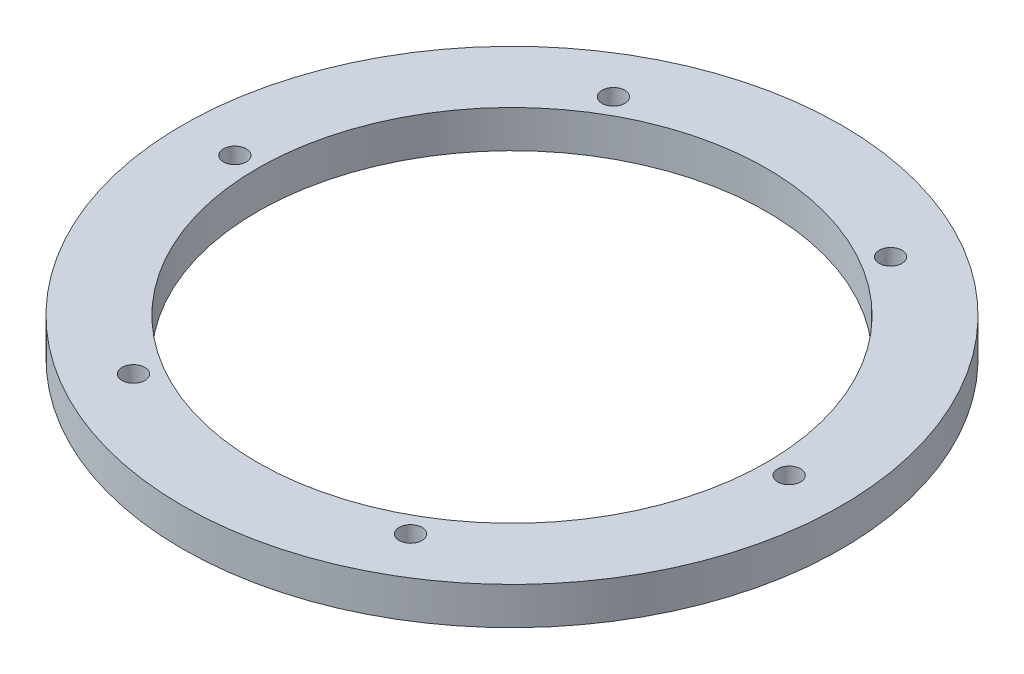
ISO-10303-21;
HEADER;
FILE_DESCRIPTION(('STEP AP214'),'2;1');
FILE_NAME('part.step','',(''),(''),'','','');
FILE_SCHEMA(('AUTOMOTIVE_DESIGN { 1 0 10303 214 1 1 1 1 }'));
ENDSEC;
DATA;
#1=APPLICATION_CONTEXT('core data for automotive mechanical design processes');
#2=APPLICATION_PROTOCOL_DEFINITION('international standard','automotive_design',2000,#1);
#3=PRODUCT_CONTEXT('',#1,'mechanical');
#4=PRODUCT('Part','Part','',(#3));
#5=PRODUCT_RELATED_PRODUCT_CATEGORY('part','',(#4));
#6=PRODUCT_DEFINITION_FORMATION('','',#4);
#7=PRODUCT_DEFINITION_CONTEXT('part definition',#1,'design');
#8=PRODUCT_DEFINITION('design','',#6,#7);
#9=PRODUCT_DEFINITION_SHAPE('','',#8);
#10=(LENGTH_UNIT() NAMED_UNIT(*) SI_UNIT(.MILLI.,.METRE.));
#11=(NAMED_UNIT(*) PLANE_ANGLE_UNIT() SI_UNIT($,.RADIAN.));
#12=(NAMED_UNIT(*) SI_UNIT($,.STERADIAN.) SOLID_ANGLE_UNIT());
#13=UNCERTAINTY_MEASURE_WITH_UNIT(LENGTH_MEASURE(1.E-05),#10,'distance_accuracy_value','');
#14=(GEOMETRIC_REPRESENTATION_CONTEXT(3) GLOBAL_UNCERTAINTY_ASSIGNED_CONTEXT((#13)) GLOBAL_UNIT_ASSIGNED_CONTEXT((#10,
#11,#12)) REPRESENTATION_CONTEXT('',''));
#15=CARTESIAN_POINT('',(0.,0.,0.));
#16=DIRECTION('',(0.,0.,1.));
#17=DIRECTION('',(1.,0.,0.));
#18=AXIS2_PLACEMENT_3D('',#15,#16,#17);
#19=CARTESIAN_POINT('',(0.,5.,0.));
#20=DIRECTION('',(0.,1.,0.));
#21=DIRECTION('',(0.,0.,1.));
#22=AXIS2_PLACEMENT_3D('',#19,#20,#21);
#23=PLANE('',#22);
#24=CARTESIAN_POINT('',(-18.5,5.,-32.0429399400242));
#25=DIRECTION('',(0.,1.,0.));
#26=DIRECTION('',(0.,0.,1.));
#27=AXIS2_PLACEMENT_3D('',#24,#25,#26);
#28=CIRCLE('',#27,1.525);
#29=CARTESIAN_POINT('',(-18.5,5.,-30.5179399400242));
#30=VERTEX_POINT('',#29);
#31=EDGE_CURVE('E78',#30,#30,#28,.T.);
#32=ORIENTED_EDGE('',*,*,#31,.F.);
#33=EDGE_LOOP('',(#32));
#34=FACE_BOUND('',#33,.T.);
#35=CARTESIAN_POINT('',(-18.5,5.,32.0429399400242));
#36=DIRECTION('',(0.,1.,0.));
#37=DIRECTION('',(0.,0.,1.));
#38=AXIS2_PLACEMENT_3D('',#35,#36,#37);
#39=CIRCLE('',#38,1.52499999999999);
#40=CARTESIAN_POINT('',(-18.5,5.,33.5679399400242));
#41=VERTEX_POINT('',#40);
#42=EDGE_CURVE('E70',#41,#41,#39,.T.);
#43=ORIENTED_EDGE('',*,*,#42,.F.);
#44=EDGE_LOOP('',(#43));
#45=FACE_BOUND('',#44,.T.);
#46=CARTESIAN_POINT('',(37.,5.,0.));
#47=DIRECTION('',(0.,1.,0.));
#48=DIRECTION('',(0.,0.,1.));
#49=AXIS2_PLACEMENT_3D('',#46,#47,#48);
#50=CIRCLE('',#49,1.525);
#51=CARTESIAN_POINT('',(37.,5.,1.525));
#52=VERTEX_POINT('',#51);
#53=EDGE_CURVE('E54',#52,#52,#50,.T.);
#54=ORIENTED_EDGE('',*,*,#53,.F.);
#55=EDGE_LOOP('',(#54));
#56=FACE_BOUND('',#55,.T.);
#57=CARTESIAN_POINT('',(0.,5.,0.));
#58=DIRECTION('',(0.,1.,0.));
#59=DIRECTION('',(0.,0.,1.));
#60=AXIS2_PLACEMENT_3D('',#57,#58,#59);
#61=CIRCLE('',#60,44.);
#62=CARTESIAN_POINT('',(0.,5.,44.));
#63=VERTEX_POINT('',#62);
#64=EDGE_CURVE('E10',#63,#63,#61,.T.);
#65=ORIENTED_EDGE('',*,*,#64,.T.);
#66=EDGE_LOOP('',(#65));
#67=FACE_BOUND('',#66,.T.);
#68=CARTESIAN_POINT('',(0.,5.,0.));
#69=DIRECTION('',(0.,1.,0.));
#70=DIRECTION('',(0.,0.,1.));
#71=AXIS2_PLACEMENT_3D('',#68,#69,#70);
#72=CIRCLE('',#71,34.);
#73=CARTESIAN_POINT('',(0.,5.,34.));
#74=VERTEX_POINT('',#73);
#75=EDGE_CURVE('E49',#74,#74,#72,.T.);
#76=ORIENTED_EDGE('',*,*,#75,.F.);
#77=EDGE_LOOP('',(#76));
#78=FACE_BOUND('',#77,.T.);
#79=CARTESIAN_POINT('',(18.5,5.,32.0429399400242));
#80=DIRECTION('',(0.,1.,0.));
#81=DIRECTION('',(0.,0.,1.));
#82=AXIS2_PLACEMENT_3D('',#79,#80,#81);
#83=CIRCLE('',#82,1.525);
#84=CARTESIAN_POINT('',(18.5,5.,33.5679399400242));
#85=VERTEX_POINT('',#84);
#86=EDGE_CURVE('E61',#85,#85,#83,.T.);
#87=ORIENTED_EDGE('',*,*,#86,.F.);
#88=EDGE_LOOP('',(#87));
#89=FACE_BOUND('',#88,.T.);
#90=CARTESIAN_POINT('',(-37.,5.,0.));
#91=DIRECTION('',(0.,1.,0.));
#92=DIRECTION('',(0.,0.,1.));
#93=AXIS2_PLACEMENT_3D('',#90,#91,#92);
#94=CIRCLE('',#93,1.525);
#95=CARTESIAN_POINT('',(-37.,5.,1.525));
#96=VERTEX_POINT('',#95);
#97=EDGE_CURVE('E71',#96,#96,#94,.T.);
#98=ORIENTED_EDGE('',*,*,#97,.F.);
#99=EDGE_LOOP('',(#98));
#100=FACE_BOUND('',#99,.T.);
#101=CARTESIAN_POINT('',(18.5,5.,-32.0429399400243));
#102=DIRECTION('',(0.,1.,0.));
#103=DIRECTION('',(0.,0.,1.));
#104=AXIS2_PLACEMENT_3D('',#101,#102,#103);
#105=CIRCLE('',#104,1.525);
#106=CARTESIAN_POINT('',(18.5,5.,-30.5179399400242));
#107=VERTEX_POINT('',#106);
#108=EDGE_CURVE('E84',#107,#107,#105,.T.);
#109=ORIENTED_EDGE('',*,*,#108,.F.);
#110=EDGE_LOOP('',(#109));
#111=FACE_BOUND('',#110,.T.);
#112=ADVANCED_FACE('F39',(#34,#45,#56,#67,#78,#89,#100,#111),#23,.T.);
#113=CARTESIAN_POINT('',(0.,0.,0.));
#114=DIRECTION('',(0.,1.,0.));
#115=DIRECTION('',(0.,0.,1.));
#116=AXIS2_PLACEMENT_3D('',#113,#114,#115);
#117=PLANE('',#116);
#118=CARTESIAN_POINT('',(0.,0.,0.));
#119=DIRECTION('',(0.,1.,0.));
#120=DIRECTION('',(0.,0.,1.));
#121=AXIS2_PLACEMENT_3D('',#118,#119,#120);
#122=CIRCLE('',#121,44.);
#123=CARTESIAN_POINT('',(0.,0.,44.));
#124=VERTEX_POINT('',#123);
#125=EDGE_CURVE('E43',#124,#124,#122,.T.);
#126=ORIENTED_EDGE('',*,*,#125,.F.);
#127=EDGE_LOOP('',(#126));
#128=FACE_BOUND('',#127,.T.);
#129=CARTESIAN_POINT('',(0.,0.,0.));
#130=DIRECTION('',(0.,1.,0.));
#131=DIRECTION('',(0.,0.,1.));
#132=AXIS2_PLACEMENT_3D('',#129,#130,#131);
#133=CIRCLE('',#132,34.);
#134=CARTESIAN_POINT('',(0.,0.,34.));
#135=VERTEX_POINT('',#134);
#136=EDGE_CURVE('E55',#135,#135,#133,.T.);
#137=ORIENTED_EDGE('',*,*,#136,.T.);
#138=EDGE_LOOP('',(#137));
#139=FACE_BOUND('',#138,.T.);
#140=CARTESIAN_POINT('',(37.,0.,0.));
#141=DIRECTION('',(0.,1.,0.));
#142=DIRECTION('',(0.,0.,1.));
#143=AXIS2_PLACEMENT_3D('',#140,#141,#142);
#144=CIRCLE('',#143,1.525);
#145=CARTESIAN_POINT('',(37.,0.,1.525));
#146=VERTEX_POINT('',#145);
#147=EDGE_CURVE('E59',#146,#146,#144,.T.);
#148=ORIENTED_EDGE('',*,*,#147,.T.);
#149=EDGE_LOOP('',(#148));
#150=FACE_BOUND('',#149,.T.);
#151=CARTESIAN_POINT('',(18.5,0.,32.0429399400242));
#152=DIRECTION('',(0.,1.,0.));
#153=DIRECTION('',(0.,0.,1.));
#154=AXIS2_PLACEMENT_3D('',#151,#152,#153);
#155=CIRCLE('',#154,1.525);
#156=CARTESIAN_POINT('',(18.5,0.,33.5679399400242));
#157=VERTEX_POINT('',#156);
#158=EDGE_CURVE('E63',#157,#157,#155,.T.);
#159=ORIENTED_EDGE('',*,*,#158,.T.);
#160=EDGE_LOOP('',(#159));
#161=FACE_BOUND('',#160,.T.);
#162=CARTESIAN_POINT('',(-18.5,0.,32.0429399400242));
#163=DIRECTION('',(0.,1.,0.));
#164=DIRECTION('',(0.,0.,1.));
#165=AXIS2_PLACEMENT_3D('',#162,#163,#164);
#166=CIRCLE('',#165,1.52499999999999);
#167=CARTESIAN_POINT('',(-18.5,0.,33.5679399400242));
#168=VERTEX_POINT('',#167);
#169=EDGE_CURVE('E69',#168,#168,#166,.T.);
#170=ORIENTED_EDGE('',*,*,#169,.T.);
#171=EDGE_LOOP('',(#170));
#172=FACE_BOUND('',#171,.T.);
#173=CARTESIAN_POINT('',(-37.,0.,0.));
#174=DIRECTION('',(0.,1.,0.));
#175=DIRECTION('',(0.,0.,1.));
#176=AXIS2_PLACEMENT_3D('',#173,#174,#175);
#177=CIRCLE('',#176,1.525);
#178=CARTESIAN_POINT('',(-37.,0.,1.525));
#179=VERTEX_POINT('',#178);
#180=EDGE_CURVE('E76',#179,#179,#177,.T.);
#181=ORIENTED_EDGE('',*,*,#180,.T.);
#182=EDGE_LOOP('',(#181));
#183=FACE_BOUND('',#182,.T.);
#184=CARTESIAN_POINT('',(-18.5,0.,-32.0429399400242));
#185=DIRECTION('',(0.,1.,0.));
#186=DIRECTION('',(0.,0.,1.));
#187=AXIS2_PLACEMENT_3D('',#184,#185,#186);
#188=CIRCLE('',#187,1.525);
#189=CARTESIAN_POINT('',(-18.5,0.,-30.5179399400242));
#190=VERTEX_POINT('',#189);
#191=EDGE_CURVE('E85',#190,#190,#188,.T.);
#192=ORIENTED_EDGE('',*,*,#191,.T.);
#193=EDGE_LOOP('',(#192));
#194=FACE_BOUND('',#193,.T.);
#195=CARTESIAN_POINT('',(18.5,0.,-32.0429399400243));
#196=DIRECTION('',(0.,1.,0.));
#197=DIRECTION('',(0.,0.,1.));
#198=AXIS2_PLACEMENT_3D('',#195,#196,#197);
#199=CIRCLE('',#198,1.525);
#200=CARTESIAN_POINT('',(18.5,0.,-30.5179399400242));
#201=VERTEX_POINT('',#200);
#202=EDGE_CURVE('E86',#201,#201,#199,.T.);
#203=ORIENTED_EDGE('',*,*,#202,.T.);
#204=EDGE_LOOP('',(#203));
#205=FACE_BOUND('',#204,.T.);
#206=ADVANCED_FACE('F98',(#128,#139,#150,#161,#172,#183,#194,#205),#117,.F.);
#207=CARTESIAN_POINT('',(0.,5.,0.));
#208=DIRECTION('',(0.,-1.,0.));
#209=DIRECTION('',(0.,0.,-1.));
#210=AXIS2_PLACEMENT_3D('',#207,#208,#209);
#211=CYLINDRICAL_SURFACE('',#210,44.);
#212=ORIENTED_EDGE('',*,*,#64,.F.);
#213=EDGE_LOOP('',(#212));
#214=FACE_BOUND('',#213,.T.);
#215=ORIENTED_EDGE('',*,*,#125,.T.);
#216=EDGE_LOOP('',(#215));
#217=FACE_BOUND('',#216,.T.);
#218=ADVANCED_FACE('F41',(#214,#217),#211,.T.);
#219=CARTESIAN_POINT('',(0.,5.,0.));
#220=DIRECTION('',(0.,-1.,0.));
#221=DIRECTION('',(0.,0.,-1.));
#222=AXIS2_PLACEMENT_3D('',#219,#220,#221);
#223=CYLINDRICAL_SURFACE('',#222,34.);
#224=ORIENTED_EDGE('',*,*,#75,.T.);
#225=EDGE_LOOP('',(#224));
#226=FACE_BOUND('',#225,.T.);
#227=ORIENTED_EDGE('',*,*,#136,.F.);
#228=EDGE_LOOP('',(#227));
#229=FACE_BOUND('',#228,.T.);
#230=ADVANCED_FACE('F107',(#226,#229),#223,.F.);
#231=CARTESIAN_POINT('',(37.,5.,0.));
#232=DIRECTION('',(0.,-1.,0.));
#233=DIRECTION('',(0.,0.,-1.));
#234=AXIS2_PLACEMENT_3D('',#231,#232,#233);
#235=CYLINDRICAL_SURFACE('',#234,1.525);
#236=ORIENTED_EDGE('',*,*,#53,.T.);
#237=EDGE_LOOP('',(#236));
#238=FACE_BOUND('',#237,.T.);
#239=ORIENTED_EDGE('',*,*,#147,.F.);
#240=EDGE_LOOP('',(#239));
#241=FACE_BOUND('',#240,.T.);
#242=ADVANCED_FACE('F112',(#238,#241),#235,.F.);
#243=CARTESIAN_POINT('',(18.5,5.,32.0429399400242));
#244=DIRECTION('',(0.,-1.,0.));
#245=DIRECTION('',(0.,0.,-1.));
#246=AXIS2_PLACEMENT_3D('',#243,#244,#245);
#247=CYLINDRICAL_SURFACE('',#246,1.525);
#248=ORIENTED_EDGE('',*,*,#86,.T.);
#249=EDGE_LOOP('',(#248));
#250=FACE_BOUND('',#249,.T.);
#251=ORIENTED_EDGE('',*,*,#158,.F.);
#252=EDGE_LOOP('',(#251));
#253=FACE_BOUND('',#252,.T.);
#254=ADVANCED_FACE('F113',(#250,#253),#247,.F.);
#255=CARTESIAN_POINT('',(-18.5,5.,32.0429399400242));
#256=DIRECTION('',(0.,-1.,0.));
#257=DIRECTION('',(0.,0.,-1.));
#258=AXIS2_PLACEMENT_3D('',#255,#256,#257);
#259=CYLINDRICAL_SURFACE('',#258,1.52499999999999);
#260=ORIENTED_EDGE('',*,*,#42,.T.);
#261=EDGE_LOOP('',(#260));
#262=FACE_BOUND('',#261,.T.);
#263=ORIENTED_EDGE('',*,*,#169,.F.);
#264=EDGE_LOOP('',(#263));
#265=FACE_BOUND('',#264,.T.);
#266=ADVANCED_FACE('F118',(#262,#265),#259,.F.);
#267=CARTESIAN_POINT('',(-37.,5.,0.));
#268=DIRECTION('',(0.,-1.,0.));
#269=DIRECTION('',(0.,0.,-1.));
#270=AXIS2_PLACEMENT_3D('',#267,#268,#269);
#271=CYLINDRICAL_SURFACE('',#270,1.525);
#272=ORIENTED_EDGE('',*,*,#97,.T.);
#273=EDGE_LOOP('',(#272));
#274=FACE_BOUND('',#273,.T.);
#275=ORIENTED_EDGE('',*,*,#180,.F.);
#276=EDGE_LOOP('',(#275));
#277=FACE_BOUND('',#276,.T.);
#278=ADVANCED_FACE('F121',(#274,#277),#271,.F.);
#279=CARTESIAN_POINT('',(-18.5,5.,-32.0429399400242));
#280=DIRECTION('',(0.,-1.,0.));
#281=DIRECTION('',(0.,0.,-1.));
#282=AXIS2_PLACEMENT_3D('',#279,#280,#281);
#283=CYLINDRICAL_SURFACE('',#282,1.525);
#284=ORIENTED_EDGE('',*,*,#31,.T.);
#285=EDGE_LOOP('',(#284));
#286=FACE_BOUND('',#285,.T.);
#287=ORIENTED_EDGE('',*,*,#191,.F.);
#288=EDGE_LOOP('',(#287));
#289=FACE_BOUND('',#288,.T.);
#290=ADVANCED_FACE('F130',(#286,#289),#283,.F.);
#291=CARTESIAN_POINT('',(18.5,5.,-32.0429399400243));
#292=DIRECTION('',(0.,-1.,0.));
#293=DIRECTION('',(0.,0.,-1.));
#294=AXIS2_PLACEMENT_3D('',#291,#292,#293);
#295=CYLINDRICAL_SURFACE('',#294,1.525);
#296=ORIENTED_EDGE('',*,*,#108,.T.);
#297=EDGE_LOOP('',(#296));
#298=FACE_BOUND('',#297,.T.);
#299=ORIENTED_EDGE('',*,*,#202,.F.);
#300=EDGE_LOOP('',(#299));
#301=FACE_BOUND('',#300,.T.);
#302=ADVANCED_FACE('F94',(#298,#301),#295,.F.);
#303=CLOSED_SHELL('',(#112,#206,#218,#230,#242,#254,#266,#278,#290,#302));
#304=MANIFOLD_SOLID_BREP('B2',#303);
#305=ADVANCED_BREP_SHAPE_REPRESENTATION('',(#18,#304),#14);
#306=SHAPE_DEFINITION_REPRESENTATION(#9,#305);
ENDSEC;
END-ISO-10303-21;
